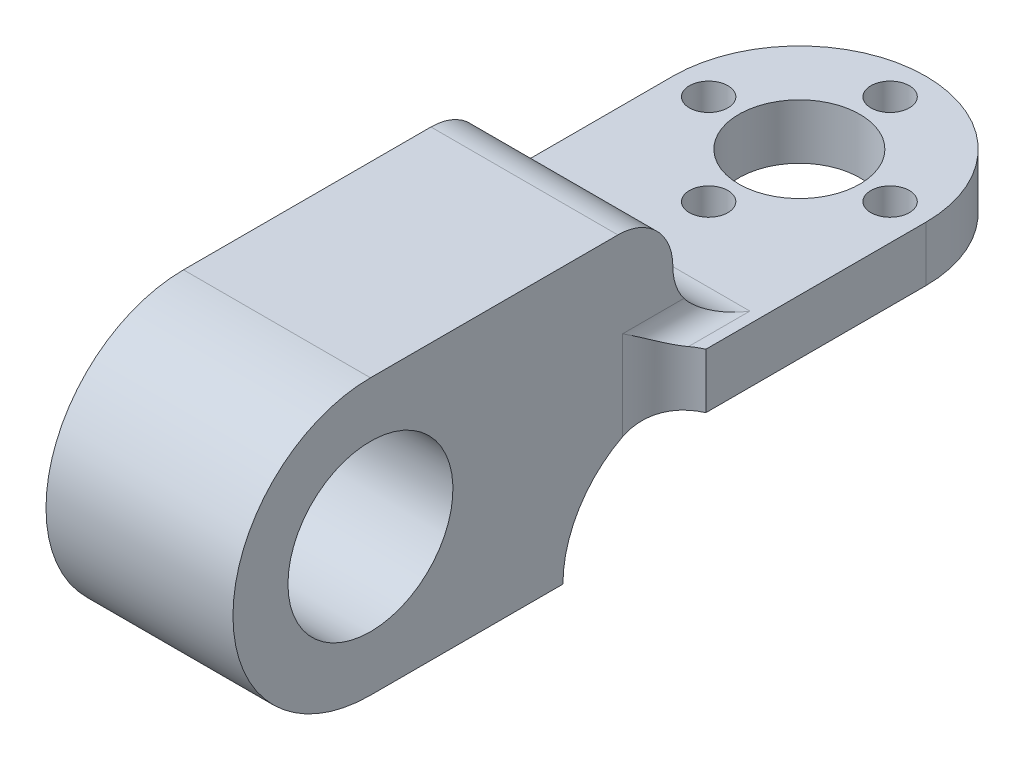
ISO-10303-21;
HEADER;
FILE_DESCRIPTION(('STEP AP214'),'2;1');
FILE_NAME('part.step','',(''),(''),'','','');
FILE_SCHEMA(('AUTOMOTIVE_DESIGN { 1 0 10303 214 1 1 1 1 }'));
ENDSEC;
DATA;
#1=APPLICATION_CONTEXT('core data for automotive mechanical design processes');
#2=APPLICATION_PROTOCOL_DEFINITION('international standard','automotive_design',2000,#1);
#3=PRODUCT_CONTEXT('',#1,'mechanical');
#4=PRODUCT('Part','Part','',(#3));
#5=PRODUCT_RELATED_PRODUCT_CATEGORY('part','',(#4));
#6=PRODUCT_DEFINITION_FORMATION('','',#4);
#7=PRODUCT_DEFINITION_CONTEXT('part definition',#1,'design');
#8=PRODUCT_DEFINITION('design','',#6,#7);
#9=PRODUCT_DEFINITION_SHAPE('','',#8);
#10=(LENGTH_UNIT() NAMED_UNIT(*) SI_UNIT(.MILLI.,.METRE.));
#11=(NAMED_UNIT(*) PLANE_ANGLE_UNIT() SI_UNIT($,.RADIAN.));
#12=(NAMED_UNIT(*) SI_UNIT($,.STERADIAN.) SOLID_ANGLE_UNIT());
#13=UNCERTAINTY_MEASURE_WITH_UNIT(LENGTH_MEASURE(1.E-05),#10,'distance_accuracy_value','');
#14=(GEOMETRIC_REPRESENTATION_CONTEXT(3) GLOBAL_UNCERTAINTY_ASSIGNED_CONTEXT((#13)) GLOBAL_UNIT_ASSIGNED_CONTEXT((#10,
#11,#12)) REPRESENTATION_CONTEXT('',''));
#15=CARTESIAN_POINT('',(0.,0.,0.));
#16=DIRECTION('',(0.,0.,1.));
#17=DIRECTION('',(1.,0.,0.));
#18=AXIS2_PLACEMENT_3D('',#15,#16,#17);
#19=CARTESIAN_POINT('',(0.,5.,0.));
#20=DIRECTION('',(0.,1.,0.));
#21=DIRECTION('',(0.,0.,1.));
#22=AXIS2_PLACEMENT_3D('',#19,#20,#21);
#23=PLANE('',#22);
#24=CARTESIAN_POINT('',(8.25,5.,0.));
#25=DIRECTION('',(0.,1.,0.));
#26=DIRECTION('',(0.,0.,1.));
#27=AXIS2_PLACEMENT_3D('',#24,#25,#26);
#28=CIRCLE('',#27,1.75);
#29=CARTESIAN_POINT('',(8.25,5.,1.75000000000006));
#30=VERTEX_POINT('',#29);
#31=EDGE_CURVE('E216',#30,#30,#28,.T.);
#32=ORIENTED_EDGE('',*,*,#31,.F.);
#33=EDGE_LOOP('',(#32));
#34=FACE_BOUND('',#33,.T.);
#35=CARTESIAN_POINT('',(-8.25,5.,0.));
#36=DIRECTION('',(0.,1.,0.));
#37=DIRECTION('',(0.,0.,1.));
#38=AXIS2_PLACEMENT_3D('',#35,#36,#37);
#39=CIRCLE('',#38,1.75);
#40=CARTESIAN_POINT('',(-8.25,5.,1.75));
#41=VERTEX_POINT('',#40);
#42=EDGE_CURVE('E228',#41,#41,#39,.T.);
#43=ORIENTED_EDGE('',*,*,#42,.F.);
#44=EDGE_LOOP('',(#43));
#45=FACE_BOUND('',#44,.T.);
#46=DIRECTION('',(1.,0.,0.));
#47=VECTOR('',#46,1.);
#48=CARTESIAN_POINT('',(0.,5.,15.));
#49=LINE('',#48,#47);
#50=CARTESIAN_POINT('',(-10.5,5.,15.));
#51=VERTEX_POINT('',#50);
#52=CARTESIAN_POINT('',(10.5,5.,15.));
#53=VERTEX_POINT('',#52);
#54=EDGE_CURVE('E243',#51,#53,#49,.T.);
#55=ORIENTED_EDGE('',*,*,#54,.T.);
#56=DIRECTION('',(0.,0.,1.));
#57=VECTOR('',#56,1.);
#58=CARTESIAN_POINT('',(10.5,5.,0.));
#59=LINE('',#58,#57);
#60=CARTESIAN_POINT('',(10.5,5.,20.5825756949558));
#61=VERTEX_POINT('',#60);
#62=EDGE_CURVE('E342',#53,#61,#59,.T.);
#63=ORIENTED_EDGE('',*,*,#62,.T.);
#64=CARTESIAN_POINT('',(13.5,5.,24.5825756949558));
#65=DIRECTION('',(0.,1.,0.));
#66=DIRECTION('',(0.,0.,1.));
#67=AXIS2_PLACEMENT_3D('',#64,#65,#66);
#68=CIRCLE('',#67,5.);
#69=CARTESIAN_POINT('',(11.5,5.,20.));
#70=VERTEX_POINT('',#69);
#71=EDGE_CURVE('E261',#61,#70,#68,.F.);
#72=ORIENTED_EDGE('',*,*,#71,.T.);
#73=DIRECTION('',(0.,0.,1.));
#74=VECTOR('',#73,1.);
#75=CARTESIAN_POINT('',(11.5,5.,-11.501));
#76=LINE('',#75,#74);
#77=CARTESIAN_POINT('',(11.5,5.,0.));
#78=VERTEX_POINT('',#77);
#79=EDGE_CURVE('E200',#78,#70,#76,.T.);
#80=ORIENTED_EDGE('',*,*,#79,.F.);
#81=CARTESIAN_POINT('',(0.,5.,0.));
#82=DIRECTION('',(0.,1.,0.));
#83=DIRECTION('',(0.,0.,1.));
#84=AXIS2_PLACEMENT_3D('',#81,#82,#83);
#85=CIRCLE('',#84,11.5);
#86=CARTESIAN_POINT('',(-11.5,5.,0.));
#87=VERTEX_POINT('',#86);
#88=EDGE_CURVE('E240',#78,#87,#85,.T.);
#89=ORIENTED_EDGE('',*,*,#88,.T.);
#90=DIRECTION('',(0.,0.,1.));
#91=VECTOR('',#90,1.);
#92=CARTESIAN_POINT('',(-11.5,5.,-11.501));
#93=LINE('',#92,#91);
#94=CARTESIAN_POINT('',(-11.5,5.,20.));
#95=VERTEX_POINT('',#94);
#96=EDGE_CURVE('E203',#87,#95,#93,.T.);
#97=ORIENTED_EDGE('',*,*,#96,.T.);
#98=CARTESIAN_POINT('',(-13.5,5.,24.5825756949558));
#99=DIRECTION('',(0.,1.,0.));
#100=DIRECTION('',(0.,0.,1.));
#101=AXIS2_PLACEMENT_3D('',#98,#99,#100);
#102=CIRCLE('',#101,5.);
#103=CARTESIAN_POINT('',(-10.5,5.,20.5825756949558));
#104=VERTEX_POINT('',#103);
#105=EDGE_CURVE('E349',#95,#104,#102,.F.);
#106=ORIENTED_EDGE('',*,*,#105,.T.);
#107=DIRECTION('',(0.,0.,-1.));
#108=VECTOR('',#107,1.);
#109=CARTESIAN_POINT('',(-10.5,5.,0.));
#110=LINE('',#109,#108);
#111=EDGE_CURVE('E346',#104,#51,#110,.T.);
#112=ORIENTED_EDGE('',*,*,#111,.T.);
#113=EDGE_LOOP('',(#55,#63,#72,#80,#89,#97,#106,#112));
#114=FACE_BOUND('',#113,.T.);
#115=CARTESIAN_POINT('',(0.,5.,0.));
#116=DIRECTION('',(0.,1.,0.));
#117=DIRECTION('',(0.,0.,1.));
#118=AXIS2_PLACEMENT_3D('',#115,#116,#117);
#119=CIRCLE('',#118,5.5);
#120=CARTESIAN_POINT('',(0.,5.,5.5));
#121=VERTEX_POINT('',#120);
#122=EDGE_CURVE('E234',#121,#121,#119,.T.);
#123=ORIENTED_EDGE('',*,*,#122,.F.);
#124=EDGE_LOOP('',(#123));
#125=FACE_BOUND('',#124,.T.);
#126=CARTESIAN_POINT('',(0.,5.,-8.25));
#127=DIRECTION('',(0.,1.,0.));
#128=DIRECTION('',(0.,0.,1.));
#129=AXIS2_PLACEMENT_3D('',#126,#127,#128);
#130=CIRCLE('',#129,1.75);
#131=CARTESIAN_POINT('',(0.,5.,-6.5));
#132=VERTEX_POINT('',#131);
#133=EDGE_CURVE('E222',#132,#132,#130,.T.);
#134=ORIENTED_EDGE('',*,*,#133,.F.);
#135=EDGE_LOOP('',(#134));
#136=FACE_BOUND('',#135,.T.);
#137=CARTESIAN_POINT('',(0.,5.,8.25));
#138=DIRECTION('',(0.,1.,0.));
#139=DIRECTION('',(0.,0.,1.));
#140=AXIS2_PLACEMENT_3D('',#137,#138,#139);
#141=CIRCLE('',#140,1.75);
#142=CARTESIAN_POINT('',(0.,5.,10.));
#143=VERTEX_POINT('',#142);
#144=EDGE_CURVE('E210',#143,#143,#141,.T.);
#145=ORIENTED_EDGE('',*,*,#144,.F.);
#146=EDGE_LOOP('',(#145));
#147=FACE_BOUND('',#146,.T.);
#148=ADVANCED_FACE('F37',(#34,#45,#114,#125,#136,#147),#23,.T.);
#149=CARTESIAN_POINT('',(0.,0.,0.));
#150=DIRECTION('',(0.,1.,0.));
#151=DIRECTION('',(0.,0.,1.));
#152=AXIS2_PLACEMENT_3D('',#149,#150,#151);
#153=PLANE('',#152);
#154=CARTESIAN_POINT('',(0.,0.,0.));
#155=DIRECTION('',(0.,1.,0.));
#156=DIRECTION('',(0.,0.,1.));
#157=AXIS2_PLACEMENT_3D('',#154,#155,#156);
#158=CIRCLE('',#157,11.5);
#159=CARTESIAN_POINT('',(11.5,0.,0.));
#160=VERTEX_POINT('',#159);
#161=CARTESIAN_POINT('',(-11.5,0.,0.));
#162=VERTEX_POINT('',#161);
#163=EDGE_CURVE('E237',#160,#162,#158,.T.);
#164=ORIENTED_EDGE('',*,*,#163,.F.);
#165=DIRECTION('',(0.,0.,1.));
#166=VECTOR('',#165,1.);
#167=CARTESIAN_POINT('',(11.5,0.,-11.501));
#168=LINE('',#167,#166);
#169=CARTESIAN_POINT('',(11.5,0.,20.));
#170=VERTEX_POINT('',#169);
#171=EDGE_CURVE('E197',#160,#170,#168,.T.);
#172=ORIENTED_EDGE('',*,*,#171,.T.);
#173=DIRECTION('',(-1.,0.,0.));
#174=VECTOR('',#173,1.);
#175=CARTESIAN_POINT('',(11.5,0.,20.));
#176=LINE('',#175,#174);
#177=CARTESIAN_POINT('',(-11.5,0.,20.));
#178=VERTEX_POINT('',#177);
#179=EDGE_CURVE('E185',#170,#178,#176,.T.);
#180=ORIENTED_EDGE('',*,*,#179,.T.);
#181=DIRECTION('',(0.,0.,1.));
#182=VECTOR('',#181,1.);
#183=CARTESIAN_POINT('',(-11.5,0.,-11.501));
#184=LINE('',#183,#182);
#185=EDGE_CURVE('E205',#162,#178,#184,.T.);
#186=ORIENTED_EDGE('',*,*,#185,.F.);
#187=EDGE_LOOP('',(#164,#172,#180,#186));
#188=FACE_BOUND('',#187,.T.);
#189=CARTESIAN_POINT('',(0.,0.,0.));
#190=DIRECTION('',(0.,1.,0.));
#191=DIRECTION('',(0.,0.,1.));
#192=AXIS2_PLACEMENT_3D('',#189,#190,#191);
#193=CIRCLE('',#192,5.5);
#194=CARTESIAN_POINT('',(0.,0.,5.5));
#195=VERTEX_POINT('',#194);
#196=EDGE_CURVE('E231',#195,#195,#193,.T.);
#197=ORIENTED_EDGE('',*,*,#196,.T.);
#198=EDGE_LOOP('',(#197));
#199=FACE_BOUND('',#198,.T.);
#200=CARTESIAN_POINT('',(-8.25,0.,0.));
#201=DIRECTION('',(0.,1.,0.));
#202=DIRECTION('',(0.,0.,1.));
#203=AXIS2_PLACEMENT_3D('',#200,#201,#202);
#204=CIRCLE('',#203,1.75);
#205=CARTESIAN_POINT('',(-8.25,0.,1.75));
#206=VERTEX_POINT('',#205);
#207=EDGE_CURVE('E225',#206,#206,#204,.T.);
#208=ORIENTED_EDGE('',*,*,#207,.T.);
#209=EDGE_LOOP('',(#208));
#210=FACE_BOUND('',#209,.T.);
#211=CARTESIAN_POINT('',(0.,0.,-8.25));
#212=DIRECTION('',(0.,1.,0.));
#213=DIRECTION('',(0.,0.,1.));
#214=AXIS2_PLACEMENT_3D('',#211,#212,#213);
#215=CIRCLE('',#214,1.75);
#216=CARTESIAN_POINT('',(0.,0.,-6.5));
#217=VERTEX_POINT('',#216);
#218=EDGE_CURVE('E219',#217,#217,#215,.T.);
#219=ORIENTED_EDGE('',*,*,#218,.T.);
#220=EDGE_LOOP('',(#219));
#221=FACE_BOUND('',#220,.T.);
#222=CARTESIAN_POINT('',(8.25,0.,0.));
#223=DIRECTION('',(0.,1.,0.));
#224=DIRECTION('',(0.,0.,1.));
#225=AXIS2_PLACEMENT_3D('',#222,#223,#224);
#226=CIRCLE('',#225,1.75);
#227=CARTESIAN_POINT('',(8.25,0.,1.75000000000006));
#228=VERTEX_POINT('',#227);
#229=EDGE_CURVE('E213',#228,#228,#226,.T.);
#230=ORIENTED_EDGE('',*,*,#229,.T.);
#231=EDGE_LOOP('',(#230));
#232=FACE_BOUND('',#231,.T.);
#233=CARTESIAN_POINT('',(0.,0.,8.25));
#234=DIRECTION('',(0.,1.,0.));
#235=DIRECTION('',(0.,0.,1.));
#236=AXIS2_PLACEMENT_3D('',#233,#234,#235);
#237=CIRCLE('',#236,1.75);
#238=CARTESIAN_POINT('',(0.,0.,10.));
#239=VERTEX_POINT('',#238);
#240=EDGE_CURVE('E188',#239,#239,#237,.T.);
#241=ORIENTED_EDGE('',*,*,#240,.T.);
#242=EDGE_LOOP('',(#241));
#243=FACE_BOUND('',#242,.T.);
#244=ADVANCED_FACE('F313',(#188,#199,#210,#221,#232,#243),#153,.F.);
#245=CARTESIAN_POINT('',(0.,5.,0.));
#246=DIRECTION('',(0.,-1.,0.));
#247=DIRECTION('',(0.,0.,-1.));
#248=AXIS2_PLACEMENT_3D('',#245,#246,#247);
#249=CYLINDRICAL_SURFACE('',#248,11.5);
#250=ORIENTED_EDGE('',*,*,#88,.F.);
#251=DIRECTION('',(0.,-1.,0.));
#252=VECTOR('',#251,1.);
#253=CARTESIAN_POINT('',(11.5,5.,0.));
#254=LINE('',#253,#252);
#255=EDGE_CURVE('E189',#160,#78,#254,.F.);
#256=ORIENTED_EDGE('',*,*,#255,.F.);
#257=ORIENTED_EDGE('',*,*,#163,.T.);
#258=DIRECTION('',(0.,-1.,0.));
#259=VECTOR('',#258,1.);
#260=CARTESIAN_POINT('',(-11.5,5.,0.));
#261=LINE('',#260,#259);
#262=EDGE_CURVE('E186',#162,#87,#261,.F.);
#263=ORIENTED_EDGE('',*,*,#262,.T.);
#264=EDGE_LOOP('',(#250,#256,#257,#263));
#265=FACE_BOUND('',#264,.T.);
#266=ADVANCED_FACE('F319',(#265),#249,.T.);
#267=CARTESIAN_POINT('',(0.,5.,0.));
#268=DIRECTION('',(0.,-1.,0.));
#269=DIRECTION('',(0.,0.,-1.));
#270=AXIS2_PLACEMENT_3D('',#267,#268,#269);
#271=CYLINDRICAL_SURFACE('',#270,5.5);
#272=ORIENTED_EDGE('',*,*,#122,.T.);
#273=EDGE_LOOP('',(#272));
#274=FACE_BOUND('',#273,.T.);
#275=ORIENTED_EDGE('',*,*,#196,.F.);
#276=EDGE_LOOP('',(#275));
#277=FACE_BOUND('',#276,.T.);
#278=ADVANCED_FACE('F325',(#274,#277),#271,.F.);
#279=CARTESIAN_POINT('',(-8.25,5.,0.));
#280=DIRECTION('',(0.,-1.,0.));
#281=DIRECTION('',(0.,0.,-1.));
#282=AXIS2_PLACEMENT_3D('',#279,#280,#281);
#283=CYLINDRICAL_SURFACE('',#282,1.75);
#284=ORIENTED_EDGE('',*,*,#42,.T.);
#285=EDGE_LOOP('',(#284));
#286=FACE_BOUND('',#285,.T.);
#287=ORIENTED_EDGE('',*,*,#207,.F.);
#288=EDGE_LOOP('',(#287));
#289=FACE_BOUND('',#288,.T.);
#290=ADVANCED_FACE('F418',(#286,#289),#283,.F.);
#291=CARTESIAN_POINT('',(0.,5.,-8.25));
#292=DIRECTION('',(0.,-1.,0.));
#293=DIRECTION('',(0.,0.,-1.));
#294=AXIS2_PLACEMENT_3D('',#291,#292,#293);
#295=CYLINDRICAL_SURFACE('',#294,1.75);
#296=ORIENTED_EDGE('',*,*,#133,.T.);
#297=EDGE_LOOP('',(#296));
#298=FACE_BOUND('',#297,.T.);
#299=ORIENTED_EDGE('',*,*,#218,.F.);
#300=EDGE_LOOP('',(#299));
#301=FACE_BOUND('',#300,.T.);
#302=ADVANCED_FACE('F415',(#298,#301),#295,.F.);
#303=CARTESIAN_POINT('',(8.25,5.,0.));
#304=DIRECTION('',(0.,-1.,0.));
#305=DIRECTION('',(0.,0.,-1.));
#306=AXIS2_PLACEMENT_3D('',#303,#304,#305);
#307=CYLINDRICAL_SURFACE('',#306,1.75);
#308=ORIENTED_EDGE('',*,*,#31,.T.);
#309=EDGE_LOOP('',(#308));
#310=FACE_BOUND('',#309,.T.);
#311=ORIENTED_EDGE('',*,*,#229,.F.);
#312=EDGE_LOOP('',(#311));
#313=FACE_BOUND('',#312,.T.);
#314=ADVANCED_FACE('F411',(#310,#313),#307,.F.);
#315=CARTESIAN_POINT('',(0.,5.,8.25));
#316=DIRECTION('',(0.,-1.,0.));
#317=DIRECTION('',(0.,0.,-1.));
#318=AXIS2_PLACEMENT_3D('',#315,#316,#317);
#319=CYLINDRICAL_SURFACE('',#318,1.75);
#320=ORIENTED_EDGE('',*,*,#144,.T.);
#321=EDGE_LOOP('',(#320));
#322=FACE_BOUND('',#321,.T.);
#323=ORIENTED_EDGE('',*,*,#240,.F.);
#324=EDGE_LOOP('',(#323));
#325=FACE_BOUND('',#324,.T.);
#326=ADVANCED_FACE('F406',(#322,#325),#319,.F.);
#327=CARTESIAN_POINT('',(11.5,5.,-11.501));
#328=DIRECTION('',(-1.,0.,0.));
#329=DIRECTION('',(0.,0.,1.));
#330=AXIS2_PLACEMENT_3D('',#327,#328,#329);
#331=PLANE('',#330);
#332=ORIENTED_EDGE('',*,*,#171,.F.);
#333=ORIENTED_EDGE('',*,*,#255,.T.);
#334=ORIENTED_EDGE('',*,*,#79,.T.);
#335=DIRECTION('',(0.,-1.,0.));
#336=VECTOR('',#335,1.);
#337=CARTESIAN_POINT('',(11.5,5.,20.));
#338=LINE('',#337,#336);
#339=EDGE_CURVE('E194',#70,#170,#338,.T.);
#340=ORIENTED_EDGE('',*,*,#339,.T.);
#341=EDGE_LOOP('',(#332,#333,#334,#340));
#342=FACE_BOUND('',#341,.T.);
#343=ADVANCED_FACE('F366',(#342),#331,.F.);
#344=CARTESIAN_POINT('',(-11.5,0.,-11.501));
#345=DIRECTION('',(1.,0.,0.));
#346=DIRECTION('',(0.,0.,-1.));
#347=AXIS2_PLACEMENT_3D('',#344,#345,#346);
#348=PLANE('',#347);
#349=ORIENTED_EDGE('',*,*,#262,.F.);
#350=ORIENTED_EDGE('',*,*,#185,.T.);
#351=DIRECTION('',(0.,1.,0.));
#352=VECTOR('',#351,1.);
#353=CARTESIAN_POINT('',(-11.5,0.,20.));
#354=LINE('',#353,#352);
#355=EDGE_CURVE('E191',#178,#95,#354,.T.);
#356=ORIENTED_EDGE('',*,*,#355,.T.);
#357=ORIENTED_EDGE('',*,*,#96,.F.);
#358=EDGE_LOOP('',(#349,#350,#356,#357));
#359=FACE_BOUND('',#358,.T.);
#360=ADVANCED_FACE('F358',(#359),#348,.F.);
#361=CARTESIAN_POINT('',(-8.5,2.5,47.5));
#362=DIRECTION('',(-1.,0.,0.));
#363=DIRECTION('',(0.,0.,1.));
#364=AXIS2_PLACEMENT_3D('',#361,#362,#363);
#365=CYLINDRICAL_SURFACE('',#364,12.5);
#366=DIRECTION('',(1.,0.,0.));
#367=VECTOR('',#366,1.);
#368=CARTESIAN_POINT('',(-8.5,15.,47.5));
#369=LINE('',#368,#367);
#370=CARTESIAN_POINT('',(-8.5,15.,47.5));
#371=VERTEX_POINT('',#370);
#372=CARTESIAN_POINT('',(8.5,15.,47.5));
#373=VERTEX_POINT('',#372);
#374=EDGE_CURVE('E177',#371,#373,#369,.T.);
#375=ORIENTED_EDGE('',*,*,#374,.F.);
#376=CARTESIAN_POINT('',(-8.5,2.5,47.5));
#377=DIRECTION('',(1.,0.,0.));
#378=DIRECTION('',(0.,1.,0.));
#379=AXIS2_PLACEMENT_3D('',#376,#377,#378);
#380=CIRCLE('',#379,12.5);
#381=CARTESIAN_POINT('',(-8.5,-10.,47.5));
#382=VERTEX_POINT('',#381);
#383=EDGE_CURVE('E181',#382,#371,#380,.F.);
#384=ORIENTED_EDGE('',*,*,#383,.F.);
#385=DIRECTION('',(1.,0.,0.));
#386=VECTOR('',#385,1.);
#387=CARTESIAN_POINT('',(-8.5,-10.,47.5));
#388=LINE('',#387,#386);
#389=CARTESIAN_POINT('',(8.5,-10.,47.5));
#390=VERTEX_POINT('',#389);
#391=EDGE_CURVE('E164',#390,#382,#388,.F.);
#392=ORIENTED_EDGE('',*,*,#391,.F.);
#393=CARTESIAN_POINT('',(8.5,2.5,47.5));
#394=DIRECTION('',(-1.,0.,0.));
#395=DIRECTION('',(0.,-1.,0.));
#396=AXIS2_PLACEMENT_3D('',#393,#394,#395);
#397=CIRCLE('',#396,12.5);
#398=EDGE_CURVE('E183',#373,#390,#397,.F.);
#399=ORIENTED_EDGE('',*,*,#398,.F.);
#400=EDGE_LOOP('',(#375,#384,#392,#399));
#401=FACE_BOUND('',#400,.T.);
#402=ADVANCED_FACE('F397',(#401),#365,.T.);
#403=CARTESIAN_POINT('',(8.5,15.,60.));
#404=DIRECTION('',(-1.,0.,0.));
#405=DIRECTION('',(0.,-1.,0.));
#406=AXIS2_PLACEMENT_3D('',#403,#404,#405);
#407=PLANE('',#406);
#408=CARTESIAN_POINT('',(8.5,2.5,47.5));
#409=DIRECTION('',(-1.,0.,0.));
#410=DIRECTION('',(0.,-1.,0.));
#411=AXIS2_PLACEMENT_3D('',#408,#409,#410);
#412=CIRCLE('',#411,7.5);
#413=CARTESIAN_POINT('',(8.5,-5.,47.5));
#414=VERTEX_POINT('',#413);
#415=EDGE_CURVE('E171',#414,#414,#412,.T.);
#416=ORIENTED_EDGE('',*,*,#415,.T.);
#417=EDGE_LOOP('',(#416));
#418=FACE_BOUND('',#417,.T.);
#419=DIRECTION('',(0.,1.,0.));
#420=VECTOR('',#419,1.);
#421=CARTESIAN_POINT('',(8.5,15.,24.5825756949558));
#422=LINE('',#421,#420);
#423=CARTESIAN_POINT('',(8.50000000000001,-1.11180558268441,24.5825756949558));
#424=VERTEX_POINT('',#423);
#425=CARTESIAN_POINT('',(8.5,7.,24.5825756949558));
#426=VERTEX_POINT('',#425);
#427=EDGE_CURVE('E158',#424,#426,#422,.T.);
#428=ORIENTED_EDGE('',*,*,#427,.T.);
#429=DIRECTION('',(0.,0.,1.));
#430=VECTOR('',#429,1.);
#431=CARTESIAN_POINT('',(8.5,7.,60.));
#432=LINE('',#431,#430);
#433=CARTESIAN_POINT('',(8.5,7.,19.));
#434=VERTEX_POINT('',#433);
#435=EDGE_CURVE('E345',#426,#434,#432,.F.);
#436=ORIENTED_EDGE('',*,*,#435,.T.);
#437=CARTESIAN_POINT('',(8.5,10.,15.));
#438=DIRECTION('',(-1.,0.,0.));
#439=DIRECTION('',(0.,-1.,0.));
#440=AXIS2_PLACEMENT_3D('',#437,#438,#439);
#441=CIRCLE('',#440,5.);
#442=CARTESIAN_POINT('',(8.5,10.,20.));
#443=VERTEX_POINT('',#442);
#444=EDGE_CURVE('E252',#434,#443,#441,.T.);
#445=ORIENTED_EDGE('',*,*,#444,.T.);
#446=CARTESIAN_POINT('',(8.5,10.,25.));
#447=DIRECTION('',(-1.,0.,0.));
#448=DIRECTION('',(0.,-1.,0.));
#449=AXIS2_PLACEMENT_3D('',#446,#447,#448);
#450=CIRCLE('',#449,5.);
#451=CARTESIAN_POINT('',(8.5,15.,25.));
#452=VERTEX_POINT('',#451);
#453=EDGE_CURVE('E250',#443,#452,#450,.F.);
#454=ORIENTED_EDGE('',*,*,#453,.T.);
#455=DIRECTION('',(0.,0.,-1.));
#456=VECTOR('',#455,1.);
#457=CARTESIAN_POINT('',(8.5,15.,60.));
#458=LINE('',#457,#456);
#459=EDGE_CURVE('E169',#373,#452,#458,.T.);
#460=ORIENTED_EDGE('',*,*,#459,.F.);
#461=ORIENTED_EDGE('',*,*,#398,.T.);
#462=DIRECTION('',(0.,0.,-1.));
#463=VECTOR('',#462,1.);
#464=CARTESIAN_POINT('',(8.5,-10.,60.));
#465=LINE('',#464,#463);
#466=CARTESIAN_POINT('',(8.5,-10.,30.));
#467=VERTEX_POINT('',#466);
#468=EDGE_CURVE('E166',#390,#467,#465,.T.);
#469=ORIENTED_EDGE('',*,*,#468,.T.);
#470=CARTESIAN_POINT('',(8.50000000000001,-10.,20.));
#471=DIRECTION('',(-1.,0.,0.));
#472=DIRECTION('',(0.,-1.,0.));
#473=AXIS2_PLACEMENT_3D('',#470,#471,#472);
#474=CIRCLE('',#473,10.);
#475=EDGE_CURVE('E149',#467,#424,#474,.T.);
#476=ORIENTED_EDGE('',*,*,#475,.T.);
#477=EDGE_LOOP('',(#428,#436,#445,#454,#460,#461,#469,#476));
#478=FACE_BOUND('',#477,.T.);
#479=ADVANCED_FACE('F370',(#418,#478),#407,.F.);
#480=CARTESIAN_POINT('',(-8.5,15.,60.));
#481=DIRECTION('',(0.,-1.,0.));
#482=DIRECTION('',(0.,0.,-1.));
#483=AXIS2_PLACEMENT_3D('',#480,#481,#482);
#484=PLANE('',#483);
#485=ORIENTED_EDGE('',*,*,#459,.T.);
#486=DIRECTION('',(-1.,0.,0.));
#487=VECTOR('',#486,1.);
#488=CARTESIAN_POINT('',(-8.5,15.,25.));
#489=LINE('',#488,#487);
#490=CARTESIAN_POINT('',(-8.5,15.,25.));
#491=VERTEX_POINT('',#490);
#492=EDGE_CURVE('E246',#452,#491,#489,.T.);
#493=ORIENTED_EDGE('',*,*,#492,.T.);
#494=DIRECTION('',(0.,0.,-1.));
#495=VECTOR('',#494,1.);
#496=CARTESIAN_POINT('',(-8.5,15.,60.));
#497=LINE('',#496,#495);
#498=EDGE_CURVE('E165',#371,#491,#497,.T.);
#499=ORIENTED_EDGE('',*,*,#498,.F.);
#500=ORIENTED_EDGE('',*,*,#374,.T.);
#501=EDGE_LOOP('',(#485,#493,#499,#500));
#502=FACE_BOUND('',#501,.T.);
#503=ADVANCED_FACE('F390',(#502),#484,.F.);
#504=CARTESIAN_POINT('',(-8.5,15.,60.));
#505=DIRECTION('',(1.,0.,0.));
#506=DIRECTION('',(0.,1.,0.));
#507=AXIS2_PLACEMENT_3D('',#504,#505,#506);
#508=PLANE('',#507);
#509=CARTESIAN_POINT('',(-8.5,2.5,47.5));
#510=DIRECTION('',(-1.,0.,0.));
#511=DIRECTION('',(0.,0.,1.));
#512=AXIS2_PLACEMENT_3D('',#509,#510,#511);
#513=CIRCLE('',#512,7.5);
#514=CARTESIAN_POINT('',(-8.5,2.5,55.));
#515=VERTEX_POINT('',#514);
#516=EDGE_CURVE('E257',#515,#515,#513,.T.);
#517=ORIENTED_EDGE('',*,*,#516,.F.);
#518=EDGE_LOOP('',(#517));
#519=FACE_BOUND('',#518,.T.);
#520=CARTESIAN_POINT('',(-8.5,10.,15.));
#521=DIRECTION('',(1.,0.,0.));
#522=DIRECTION('',(0.,1.,0.));
#523=AXIS2_PLACEMENT_3D('',#520,#521,#522);
#524=CIRCLE('',#523,5.);
#525=CARTESIAN_POINT('',(-8.5,10.,20.));
#526=VERTEX_POINT('',#525);
#527=CARTESIAN_POINT('',(-8.5,7.,19.));
#528=VERTEX_POINT('',#527);
#529=EDGE_CURVE('E159',#526,#528,#524,.T.);
#530=ORIENTED_EDGE('',*,*,#529,.T.);
#531=DIRECTION('',(0.,0.,-1.));
#532=VECTOR('',#531,1.);
#533=CARTESIAN_POINT('',(-8.5,7.,60.));
#534=LINE('',#533,#532);
#535=CARTESIAN_POINT('',(-8.5,7.,24.5825756949558));
#536=VERTEX_POINT('',#535);
#537=EDGE_CURVE('E296',#528,#536,#534,.F.);
#538=ORIENTED_EDGE('',*,*,#537,.T.);
#539=DIRECTION('',(0.,-1.,0.));
#540=VECTOR('',#539,1.);
#541=CARTESIAN_POINT('',(-8.5,15.,24.5825756949558));
#542=LINE('',#541,#540);
#543=CARTESIAN_POINT('',(-8.50000000000001,-1.11180558268441,24.5825756949558));
#544=VERTEX_POINT('',#543);
#545=EDGE_CURVE('E56',#536,#544,#542,.T.);
#546=ORIENTED_EDGE('',*,*,#545,.T.);
#547=CARTESIAN_POINT('',(-8.50000000000001,-10.,20.));
#548=DIRECTION('',(1.,0.,0.));
#549=DIRECTION('',(0.,1.,0.));
#550=AXIS2_PLACEMENT_3D('',#547,#548,#549);
#551=CIRCLE('',#550,10.);
#552=CARTESIAN_POINT('',(-8.49999999999999,-10.,30.));
#553=VERTEX_POINT('',#552);
#554=EDGE_CURVE('E142',#544,#553,#551,.T.);
#555=ORIENTED_EDGE('',*,*,#554,.T.);
#556=DIRECTION('',(0.,0.,-1.));
#557=VECTOR('',#556,1.);
#558=CARTESIAN_POINT('',(-8.5,-10.,60.));
#559=LINE('',#558,#557);
#560=EDGE_CURVE('E146',#382,#553,#559,.T.);
#561=ORIENTED_EDGE('',*,*,#560,.F.);
#562=ORIENTED_EDGE('',*,*,#383,.T.);
#563=ORIENTED_EDGE('',*,*,#498,.T.);
#564=CARTESIAN_POINT('',(-8.5,10.,25.));
#565=DIRECTION('',(1.,0.,0.));
#566=DIRECTION('',(0.,1.,0.));
#567=AXIS2_PLACEMENT_3D('',#564,#565,#566);
#568=CIRCLE('',#567,5.);
#569=EDGE_CURVE('E248',#491,#526,#568,.F.);
#570=ORIENTED_EDGE('',*,*,#569,.T.);
#571=EDGE_LOOP('',(#530,#538,#546,#555,#561,#562,#563,#570));
#572=FACE_BOUND('',#571,.T.);
#573=ADVANCED_FACE('F144',(#519,#572),#508,.F.);
#574=CARTESIAN_POINT('',(-8.5,-10.,60.));
#575=DIRECTION('',(0.,1.,0.));
#576=DIRECTION('',(0.,0.,1.));
#577=AXIS2_PLACEMENT_3D('',#574,#575,#576);
#578=PLANE('',#577);
#579=ORIENTED_EDGE('',*,*,#560,.T.);
#580=DIRECTION('',(1.,0.,0.));
#581=VECTOR('',#580,1.);
#582=CARTESIAN_POINT('',(-128.699561014691,-10.,30.));
#583=LINE('',#582,#581);
#584=EDGE_CURVE('E152',#553,#467,#583,.T.);
#585=ORIENTED_EDGE('',*,*,#584,.T.);
#586=ORIENTED_EDGE('',*,*,#468,.F.);
#587=ORIENTED_EDGE('',*,*,#391,.T.);
#588=EDGE_LOOP('',(#579,#585,#586,#587));
#589=FACE_BOUND('',#588,.T.);
#590=ADVANCED_FACE('F162',(#589),#578,.F.);
#591=CARTESIAN_POINT('',(11.5,2.5,47.5));
#592=DIRECTION('',(-1.,0.,0.));
#593=DIRECTION('',(0.,0.,1.));
#594=AXIS2_PLACEMENT_3D('',#591,#592,#593);
#595=CYLINDRICAL_SURFACE('',#594,7.5);
#596=ORIENTED_EDGE('',*,*,#516,.T.);
#597=EDGE_LOOP('',(#596));
#598=FACE_BOUND('',#597,.T.);
#599=ORIENTED_EDGE('',*,*,#415,.F.);
#600=EDGE_LOOP('',(#599));
#601=FACE_BOUND('',#600,.T.);
#602=ADVANCED_FACE('F378',(#598,#601),#595,.F.);
#603=CARTESIAN_POINT('',(-8.5,10.,25.));
#604=DIRECTION('',(-1.,0.,0.));
#605=DIRECTION('',(0.,0.,1.));
#606=AXIS2_PLACEMENT_3D('',#603,#604,#605);
#607=CYLINDRICAL_SURFACE('',#606,5.);
#608=DIRECTION('',(-1.,0.,0.));
#609=VECTOR('',#608,1.);
#610=CARTESIAN_POINT('',(0.,10.,20.));
#611=LINE('',#610,#609);
#612=EDGE_CURVE('E255',#526,#443,#611,.F.);
#613=ORIENTED_EDGE('',*,*,#612,.F.);
#614=ORIENTED_EDGE('',*,*,#569,.F.);
#615=ORIENTED_EDGE('',*,*,#492,.F.);
#616=ORIENTED_EDGE('',*,*,#453,.F.);
#617=EDGE_LOOP('',(#613,#614,#615,#616));
#618=FACE_BOUND('',#617,.T.);
#619=ADVANCED_FACE('F283',(#618),#607,.T.);
#620=CARTESIAN_POINT('',(0.,10.,15.));
#621=DIRECTION('',(1.,0.,0.));
#622=DIRECTION('',(0.,0.,-1.));
#623=AXIS2_PLACEMENT_3D('',#620,#621,#622);
#624=CYLINDRICAL_SURFACE('',#623,5.);
#625=ORIENTED_EDGE('',*,*,#529,.F.);
#626=ORIENTED_EDGE('',*,*,#612,.T.);
#627=ORIENTED_EDGE('',*,*,#444,.F.);
#628=CARTESIAN_POINT('',(8.5,7.,19.));
#629=CARTESIAN_POINT('',(8.50000675972657,6.93158584431927,18.9487080610621));
#630=CARTESIAN_POINT('',(8.50350842796633,6.86455821852767,18.8956778094956));
#631=CARTESIAN_POINT('',(8.51671090290415,6.73376301953585,18.7866726896654));
#632=CARTESIAN_POINT('',(8.52640098440018,6.66999001182352,18.7307030693738));
#633=CARTESIAN_POINT('',(8.55107718728248,6.54654150724053,18.6167152356291));
#634=CARTESIAN_POINT('',(8.56601209046857,6.48683282305515,18.5587215528404));
#635=CARTESIAN_POINT('',(8.60052227484143,6.37100202672924,18.4405267617593));
#636=CARTESIAN_POINT('',(8.62010027868032,6.3148820435623,18.3803243758878));
#637=CARTESIAN_POINT('',(8.67244414905785,6.18332284605751,18.2321085619681));
#638=CARTESIAN_POINT('',(8.70728142470638,6.10978618138672,18.1431302063391));
#639=CARTESIAN_POINT('',(8.78360058480636,5.97029430762885,17.9621850965987));
#640=CARTESIAN_POINT('',(8.82508412025497,5.90434098933117,17.8702176044928));
#641=CARTESIAN_POINT('',(8.95811121958218,5.71697330125327,17.5896743194651));
#642=CARTESIAN_POINT('',(9.05789389268571,5.60683184948249,17.3973511891724));
#643=CARTESIAN_POINT('',(9.24026359924361,5.4432848498546,17.0639931913121));
#644=CARTESIAN_POINT('',(9.3193534892754,5.38270544554123,16.9243958449696));
#645=CARTESIAN_POINT('',(9.48279375794198,5.27522285035326,16.6429135419546));
#646=CARTESIAN_POINT('',(9.56714643352449,5.22832568251079,16.5010276067419));
#647=CARTESIAN_POINT('',(9.73931143366017,5.14787588521363,16.2160487263164));
#648=CARTESIAN_POINT('',(9.82711619507983,5.11429569469862,16.0729589065398));
#649=CARTESIAN_POINT('',(10.0050321913334,5.0599857310582,15.7858725815477));
#650=CARTESIAN_POINT('',(10.0951426785276,5.03925184610523,15.6418763813678));
#651=CARTESIAN_POINT('',(10.287554785683,5.00865251719647,15.3359258819783));
#652=CARTESIAN_POINT('',(10.3900148896152,5.00040130739057,15.1739022200003));
#653=CARTESIAN_POINT('',(10.494960502319,5.00000476459275,15.0079681464868));
#654=CARTESIAN_POINT('',(10.4974802675754,5.00000000295223,15.0039840478495));
#655=CARTESIAN_POINT('',(10.5,5.,15.));
#656=B_SPLINE_CURVE_WITH_KNOTS('',3,(#628,#629,#630,#631,#632,#633,#634,#635,#636,#637,#638,
#639,#640,#641,#642,#643,#644,#645,#646,#647,#648,#649,#650,#651,#652,#653,#654,#655),
.UNSPECIFIED.,.F.,.F.,(4,2,2,2,2,2,2,2,2,2,2,2,2,4),(0.,0.25632358612088,0.512204136350952,
0.765652360303693,1.01924957198093,1.38041574025909,1.74167176531566,2.46784096790538,
2.9817850181479,3.49595497056345,4.00905516339228,4.52199103886929,5.09684964624113,
5.11099178908029),.UNSPECIFIED.);
#657=EDGE_CURVE('E295',#434,#53,#656,.T.);
#658=ORIENTED_EDGE('',*,*,#657,.T.);
#659=ORIENTED_EDGE('',*,*,#54,.F.);
#660=CARTESIAN_POINT('',(-8.5,7.,19.));
#661=CARTESIAN_POINT('',(-8.50000675972657,6.93158584431927,18.9487080610621));
#662=CARTESIAN_POINT('',(-8.50350842796633,6.86455821852767,18.8956778094956));
#663=CARTESIAN_POINT('',(-8.51671090290415,6.73376301953585,18.7866726896654));
#664=CARTESIAN_POINT('',(-8.52640098440018,6.66999001182352,18.7307030693738));
#665=CARTESIAN_POINT('',(-8.55107718728249,6.54654150724053,18.6167152356291));
#666=CARTESIAN_POINT('',(-8.56601209046857,6.48683282305515,18.5587215528404));
#667=CARTESIAN_POINT('',(-8.60052227484144,6.37100202672924,18.4405267617593));
#668=CARTESIAN_POINT('',(-8.62010027868032,6.3148820435623,18.3803243758878));
#669=CARTESIAN_POINT('',(-8.67244414905785,6.18332284605751,18.2321085619681));
#670=CARTESIAN_POINT('',(-8.70728142470638,6.10978618138672,18.1431302063391));
#671=CARTESIAN_POINT('',(-8.78360058480636,5.97029430762885,17.9621850965987));
#672=CARTESIAN_POINT('',(-8.82508412025497,5.90434098933117,17.8702176044928));
#673=CARTESIAN_POINT('',(-8.95811121958218,5.71697330125327,17.5896743194651));
#674=CARTESIAN_POINT('',(-9.05789389268571,5.60683184948249,17.3973511891724));
#675=CARTESIAN_POINT('',(-9.24026359924361,5.4432848498546,17.0639931913121));
#676=CARTESIAN_POINT('',(-9.3193534892754,5.38270544554123,16.9243958449696));
#677=CARTESIAN_POINT('',(-9.48279375794198,5.27522285035326,16.6429135419546));
#678=CARTESIAN_POINT('',(-9.56714643352449,5.22832568251079,16.5010276067419));
#679=CARTESIAN_POINT('',(-9.73931143366017,5.14787588521363,16.2160487263164));
#680=CARTESIAN_POINT('',(-9.82711619507983,5.11429569469862,16.0729589065398));
#681=CARTESIAN_POINT('',(-10.0050321913334,5.0599857310582,15.7858725815477));
#682=CARTESIAN_POINT('',(-10.0951426785276,5.03925184610523,15.6418763813678));
#683=CARTESIAN_POINT('',(-10.287554785683,5.00865251719647,15.3359258819783));
#684=CARTESIAN_POINT('',(-10.3900148896152,5.00040130739057,15.1739022200003));
#685=CARTESIAN_POINT('',(-10.494960502319,5.00000476459275,15.0079681464868));
#686=CARTESIAN_POINT('',(-10.4974802675754,5.00000000295223,15.0039840478495));
#687=CARTESIAN_POINT('',(-10.5,5.,15.));
#688=B_SPLINE_CURVE_WITH_KNOTS('',3,(#660,#661,#662,#663,#664,#665,#666,#667,#668,#669,#670,
#671,#672,#673,#674,#675,#676,#677,#678,#679,#680,#681,#682,#683,#684,#685,#686,#687),
.UNSPECIFIED.,.F.,.F.,(4,2,2,2,2,2,2,2,2,2,2,2,2,4),(0.,0.25632358612088,0.512204136350952,
0.765652360303693,1.01924957198093,1.38041574025909,1.74167176531566,2.46784096790538,
2.9817850181479,3.49595497056345,4.00905516339228,4.52199103886929,5.09684964624113,
5.11099178908029),.UNSPECIFIED.);
#689=EDGE_CURVE('E50',#51,#528,#688,.F.);
#690=ORIENTED_EDGE('',*,*,#689,.T.);
#691=EDGE_LOOP('',(#625,#626,#627,#658,#659,#690));
#692=FACE_BOUND('',#691,.T.);
#693=ADVANCED_FACE('F330',(#692),#624,.F.);
#694=CARTESIAN_POINT('',(-128.699561014691,-10.,20.));
#695=DIRECTION('',(1.,0.,0.));
#696=DIRECTION('',(0.,0.,-1.));
#697=AXIS2_PLACEMENT_3D('',#694,#695,#696);
#698=CYLINDRICAL_SURFACE('',#697,10.);
#699=ORIENTED_EDGE('',*,*,#475,.F.);
#700=ORIENTED_EDGE('',*,*,#584,.F.);
#701=ORIENTED_EDGE('',*,*,#554,.F.);
#702=CARTESIAN_POINT('',(-8.5,-1.11180558268441,24.5825756949558));
#703=CARTESIAN_POINT('',(-8.49998425064045,-1.04936900386868,24.4615238420404));
#704=CARTESIAN_POINT('',(-8.50439623199432,-0.98942825428263,24.3391462005593));
#705=CARTESIAN_POINT('',(-8.5225369335324,-0.874798118258965,24.0925626901687));
#706=CARTESIAN_POINT('',(-8.53627048394247,-0.820111471157416,23.9683559060988));
#707=CARTESIAN_POINT('',(-8.57353043167293,-0.716275965560405,23.7189720539102));
#708=CARTESIAN_POINT('',(-8.5970641119166,-0.667131260122859,23.5937943322797));
#709=CARTESIAN_POINT('',(-8.6542309397479,-0.574614722372453,23.3436335930553));
#710=CARTESIAN_POINT('',(-8.68786211585084,-0.531241765538625,23.2186505422369));
#711=CARTESIAN_POINT('',(-8.76553040068679,-0.450181079692113,22.9695417008475));
#712=CARTESIAN_POINT('',(-8.80960394095633,-0.412514029340677,22.8454205139549));
#713=CARTESIAN_POINT('',(-8.90808981328187,-0.342982903255799,22.5996783547729));
#714=CARTESIAN_POINT('',(-8.96250200790563,-0.311118750395191,22.4780573492722));
#715=CARTESIAN_POINT('',(-9.08141568028424,-0.253022555852541,22.2386572756788));
#716=CARTESIAN_POINT('',(-9.14590435869589,-0.226783468047319,22.1208735596709));
#717=CARTESIAN_POINT('',(-9.28468289278779,-0.179549384003586,21.8901372475895));
#718=CARTESIAN_POINT('',(-9.35897217371664,-0.158554080454725,21.777184368728));
#719=CARTESIAN_POINT('',(-9.51330481023592,-0.122194468630303,21.5621489804615));
#720=CARTESIAN_POINT('',(-9.59293594042014,-0.106618424304954,21.4598058783913));
#721=CARTESIAN_POINT('',(-9.76022518898395,-0.07935525966262,21.2612897008872));
#722=CARTESIAN_POINT('',(-9.8478863100422,-0.0676696017214965,21.1651189565503));
#723=CARTESIAN_POINT('',(-10.030667413853,-0.0476696788067232,20.9797045965743));
#724=CARTESIAN_POINT('',(-10.1257898377647,-0.0393565227714337,20.8904632672364));
#725=CARTESIAN_POINT('',(-10.3228347406529,-0.0255557521054665,20.7195918233792));
#726=CARTESIAN_POINT('',(-10.4247585319705,-0.020068684566814,20.6379631850754));
#727=CARTESIAN_POINT('',(-10.6804423149748,-0.00947044033439851,20.4491604760147));
#728=CARTESIAN_POINT('',(-10.8374837377769,-0.00555837822076114,20.3462965925672));
#729=CARTESIAN_POINT('',(-11.0806707076109,-0.00200991661298486,20.2058639048528));
#730=CARTESIAN_POINT('',(-11.1629121697854,-0.00121331959218985,20.161403547407));
#731=CARTESIAN_POINT('',(-11.3297458890614,-0.000209613089497733,20.0771657066185));
#732=CARTESIAN_POINT('',(-11.4143377510567,-2.40512847230551E-06,20.0373874420247));
#733=CARTESIAN_POINT('',(-11.5,0.,20.));
#734=B_SPLINE_CURVE_WITH_KNOTS('',3,(#702,#703,#704,#705,#706,#707,#708,#709,#710,#711,#712,
#713,#714,#715,#716,#717,#718,#719,#720,#721,#722,#723,#724,#725,#726,#727,#728,#729,#730,#731,
#732,#733),.UNSPECIFIED.,.F.,.F.,(4,2,2,2,2,2,2,2,2,2,2,2,2,2,2,4),(0.,0.408566199060701,
0.817344269658094,1.22642666553143,1.63542924203029,2.04588033075217,2.4563259637099,
2.86625441664139,3.27615884020311,3.66752357922879,4.05903526454385,4.45067558169413,
4.8423916865761,5.40429969367047,5.68465692912874,5.96496731784293),.UNSPECIFIED.);
#735=EDGE_CURVE('E270',#544,#178,#734,.T.);
#736=ORIENTED_EDGE('',*,*,#735,.T.);
#737=ORIENTED_EDGE('',*,*,#179,.F.);
#738=CARTESIAN_POINT('',(11.5,0.,20.));
#739=CARTESIAN_POINT('',(11.3747286102796,-9.79615603508876E-06,20.0546566953308));
#740=CARTESIAN_POINT('',(11.2517069343952,-0.000448139965653113,20.1144779113674));
#741=CARTESIAN_POINT('',(11.010965917164,-0.00276453919962647,20.2439867304688));
#742=CARTESIAN_POINT('',(10.8932472603524,-0.0046427799311122,20.3136756025076));
#743=CARTESIAN_POINT('',(10.6637687244441,-0.0104264015147756,20.4625589868919));
#744=CARTESIAN_POINT('',(10.5520184430039,-0.0143349450815599,20.541768181173));
#745=CARTESIAN_POINT('',(10.3354717668464,-0.0248148369036027,20.7090150049068));
#746=CARTESIAN_POINT('',(10.230674944436,-0.0313860212082041,20.7970520905358));
#747=CARTESIAN_POINT('',(10.02860534591,-0.0478470054425412,20.9814425554133));
#748=CARTESIAN_POINT('',(9.93134621594435,-0.0577426588477218,21.0778103789637));
#749=CARTESIAN_POINT('',(9.74527101876629,-0.0814798483104561,21.2779309870818));
#750=CARTESIAN_POINT('',(9.65645478323693,-0.0953213056827209,21.3816836243542));
#751=CARTESIAN_POINT('',(9.48803334409837,-0.127510746778393,21.5955009537771));
#752=CARTESIAN_POINT('',(9.40841423359168,-0.145851791955954,21.7055557293454));
#753=CARTESIAN_POINT('',(9.25877477403636,-0.187558952794595,21.9311002987494));
#754=CARTESIAN_POINT('',(9.18875389607169,-0.210924791379159,22.0465897926305));
#755=CARTESIAN_POINT('',(9.06089790355647,-0.262214535017172,22.2779597259621));
#756=CARTESIAN_POINT('',(9.00273365207719,-0.289959934972722,22.3936980077631));
#757=CARTESIAN_POINT('',(8.89599795925585,-0.350779155649635,22.6281559371564));
#758=CARTESIAN_POINT('',(8.84742638732067,-0.383852903820634,22.7468755441366));
#759=CARTESIAN_POINT('',(8.75993010188938,-0.455501312726351,22.9863306410716));
#760=CARTESIAN_POINT('',(8.72101439839475,-0.494081058700815,23.1070679024558));
#761=CARTESIAN_POINT('',(8.6528386101282,-0.576713894655641,23.3493394806054));
#762=CARTESIAN_POINT('',(8.62357670759813,-0.620765952076737,23.4708736429182));
#763=CARTESIAN_POINT('',(8.56526681665858,-0.731874070305611,23.7595013252532));
#764=CARTESIAN_POINT('',(8.54043600010465,-0.801351819547442,23.9265435431897));
#765=CARTESIAN_POINT('',(8.51596810494895,-0.912657326814681,24.1747370928653));
#766=CARTESIAN_POINT('',(8.50994140584742,-0.950882485955794,24.2569604186125));
#767=CARTESIAN_POINT('',(8.5019578363864,-1.02963654555753,24.4204992111555));
#768=CARTESIAN_POINT('',(8.5000010278002,-1.07016548097556,24.5018146641529));
#769=CARTESIAN_POINT('',(8.5,-1.11180558268441,24.5825756949558));
#770=B_SPLINE_CURVE_WITH_KNOTS('',3,(#738,#739,#740,#741,#742,#743,#744,#745,#746,#747,#748,
#749,#750,#751,#752,#753,#754,#755,#756,#757,#758,#759,#760,#761,#762,#763,#764,#765,#766,#767,
#768,#769),.UNSPECIFIED.,.F.,.F.,(4,2,2,2,2,2,2,2,2,2,2,2,2,2,2,4),(0.,0.409917590023166,
0.819887943133413,1.23049885336316,1.64108448429026,2.05239686581999,2.46370104573348,
2.87437492127076,3.28502615728566,3.6819482425876,4.07886492388675,4.47615059150631,
4.87336140964573,5.41992008822777,5.69244124108018,5.96496653026132),.UNSPECIFIED.);
#771=EDGE_CURVE('E263',#170,#424,#770,.T.);
#772=ORIENTED_EDGE('',*,*,#771,.T.);
#773=EDGE_LOOP('',(#699,#700,#701,#736,#737,#772));
#774=FACE_BOUND('',#773,.T.);
#775=ADVANCED_FACE('F153',(#774),#698,.F.);
#776=CARTESIAN_POINT('',(13.5,0.,24.5825756949558));
#777=DIRECTION('',(0.,1.,0.));
#778=DIRECTION('',(0.,0.,1.));
#779=AXIS2_PLACEMENT_3D('',#776,#777,#778);
#780=CYLINDRICAL_SURFACE('',#779,5.);
#781=ORIENTED_EDGE('',*,*,#771,.F.);
#782=ORIENTED_EDGE('',*,*,#339,.F.);
#783=ORIENTED_EDGE('',*,*,#71,.F.);
#784=CARTESIAN_POINT('',(10.5,5.,20.5825756949558));
#785=CARTESIAN_POINT('',(10.4315858443193,5.00000675972657,20.6338676338938));
#786=CARTESIAN_POINT('',(10.3645582185277,5.00350842796633,20.6868978854602));
#787=CARTESIAN_POINT('',(10.2337630195359,5.01671090290415,20.7959030052903));
#788=CARTESIAN_POINT('',(10.1699900118236,5.02640098440017,20.851872625582));
#789=CARTESIAN_POINT('',(10.0465415072406,5.05107718728247,20.9658604593267));
#790=CARTESIAN_POINT('',(9.9868328230552,5.06601209046855,21.0238541421154));
#791=CARTESIAN_POINT('',(9.87100202672926,5.10052227484143,21.1420489331965));
#792=CARTESIAN_POINT('',(9.81488204356231,5.12010027868031,21.202251319068));
#793=CARTESIAN_POINT('',(9.6833228460575,5.17244414905786,21.3504671329878));
#794=CARTESIAN_POINT('',(9.6097861813867,5.20728142470639,21.4394454886168));
#795=CARTESIAN_POINT('',(9.47029430762881,5.28360058480638,21.6203905983572));
#796=CARTESIAN_POINT('',(9.40434098933112,5.325084120255,21.7123580904631));
#797=CARTESIAN_POINT('',(9.21697330125324,5.45811121958221,21.9929013754908));
#798=CARTESIAN_POINT('',(9.10683184948248,5.55789389268574,22.1852245057835));
#799=CARTESIAN_POINT('',(8.9432848498546,5.7402635992436,22.5185825036438));
#800=CARTESIAN_POINT('',(8.88270544554124,5.81935348927537,22.6581798499863));
#801=CARTESIAN_POINT('',(8.77522285035327,5.98279375794199,22.9396621530012));
#802=CARTESIAN_POINT('',(8.7283256825108,6.06714643352457,23.0815480882138));
#803=CARTESIAN_POINT('',(8.64787588521364,6.23931143366003,23.3665269686394));
#804=CARTESIAN_POINT('',(8.61429569469863,6.3271161950794,23.5096167884162));
#805=CARTESIAN_POINT('',(8.5599857310582,6.50503219133373,23.7967031134079));
#806=CARTESIAN_POINT('',(8.53925184610523,6.59514267852906,23.9406993135872));
#807=CARTESIAN_POINT('',(8.50865251719647,6.78755478568141,24.2466498129786));
#808=CARTESIAN_POINT('',(8.50040130739057,6.89001488960876,24.4086734749596));
#809=CARTESIAN_POINT('',(8.50000476459275,6.9949605023187,24.5746075484692));
#810=CARTESIAN_POINT('',(8.50000000295223,6.99748026757523,24.5785916471064));
#811=CARTESIAN_POINT('',(8.5,7.,24.5825756949558));
#812=B_SPLINE_CURVE_WITH_KNOTS('',3,(#784,#785,#786,#787,#788,#789,#790,#791,#792,#793,#794,
#795,#796,#797,#798,#799,#800,#801,#802,#803,#804,#805,#806,#807,#808,#809,#810,#811),
.UNSPECIFIED.,.F.,.F.,(4,2,2,2,2,2,2,2,2,2,2,2,2,4),(0.,0.256323586120818,0.512204136350825,
0.765652360303633,1.01924957198093,1.38041574025915,1.74167176531577,2.46784096790538,
2.98178501814788,3.49595497056336,4.00905516339223,4.52199103886931,5.09684964624113,
5.11099178908029),.UNSPECIFIED.);
#813=EDGE_CURVE('E288',#61,#426,#812,.T.);
#814=ORIENTED_EDGE('',*,*,#813,.T.);
#815=ORIENTED_EDGE('',*,*,#427,.F.);
#816=EDGE_LOOP('',(#781,#782,#783,#814,#815));
#817=FACE_BOUND('',#816,.T.);
#818=ADVANCED_FACE('F277',(#817),#780,.F.);
#819=CARTESIAN_POINT('',(-13.5,0.,24.5825756949558));
#820=DIRECTION('',(0.,-1.,0.));
#821=DIRECTION('',(0.,0.,-1.));
#822=AXIS2_PLACEMENT_3D('',#819,#820,#821);
#823=CYLINDRICAL_SURFACE('',#822,5.);
#824=ORIENTED_EDGE('',*,*,#105,.F.);
#825=ORIENTED_EDGE('',*,*,#355,.F.);
#826=ORIENTED_EDGE('',*,*,#735,.F.);
#827=ORIENTED_EDGE('',*,*,#545,.F.);
#828=CARTESIAN_POINT('',(-10.5,5.,20.5825756949558));
#829=CARTESIAN_POINT('',(-10.4315858443193,5.00000675972657,20.6338676338938));
#830=CARTESIAN_POINT('',(-10.3645582185277,5.00350842796633,20.6868978854602));
#831=CARTESIAN_POINT('',(-10.2337630195359,5.01671090290415,20.7959030052904));
#832=CARTESIAN_POINT('',(-10.1699900118236,5.02640098440017,20.851872625582));
#833=CARTESIAN_POINT('',(-10.0465415072406,5.05107718728248,20.9658604593267));
#834=CARTESIAN_POINT('',(-9.98683282305518,5.06601209046856,21.0238541421154));
#835=CARTESIAN_POINT('',(-9.87100202672925,5.10052227484143,21.1420489331965));
#836=CARTESIAN_POINT('',(-9.81488204356231,5.12010027868032,21.202251319068));
#837=CARTESIAN_POINT('',(-9.68332284605751,5.17244414905785,21.3504671329878));
#838=CARTESIAN_POINT('',(-9.60978618138671,5.20728142470639,21.4394454886168));
#839=CARTESIAN_POINT('',(-9.47029430762883,5.28360058480637,21.6203905983572));
#840=CARTESIAN_POINT('',(-9.40434098933115,5.32508412025499,21.7123580904631));
#841=CARTESIAN_POINT('',(-9.21697330125326,5.45811121958219,21.9929013754908));
#842=CARTESIAN_POINT('',(-9.10683184948249,5.55789389268572,22.1852245057835));
#843=CARTESIAN_POINT('',(-8.94328484985461,5.7402635992436,22.5185825036438));
#844=CARTESIAN_POINT('',(-8.88270544554124,5.81935348927538,22.6581798499862));
#845=CARTESIAN_POINT('',(-8.77522285035326,5.98279375794198,22.9396621530012));
#846=CARTESIAN_POINT('',(-8.7283256825108,6.06714643352453,23.0815480882139));
#847=CARTESIAN_POINT('',(-8.64787588521363,6.2393114336601,23.3665269686394));
#848=CARTESIAN_POINT('',(-8.61429569469862,6.32711619507961,23.5096167884161));
#849=CARTESIAN_POINT('',(-8.5599857310582,6.50503219133356,23.796703113408));
#850=CARTESIAN_POINT('',(-8.53925184610523,6.59514267852836,23.9406993135876));
#851=CARTESIAN_POINT('',(-8.50865251719647,6.78755478568221,24.2466498129781));
#852=CARTESIAN_POINT('',(-8.50040130739057,6.89001488961188,24.4086734749577));
#853=CARTESIAN_POINT('',(-8.50000476459275,6.99496050231885,24.5746075484691));
#854=CARTESIAN_POINT('',(-8.50000000295223,6.99748026757531,24.5785916471063));
#855=CARTESIAN_POINT('',(-8.5,7.,24.5825756949558));
#856=B_SPLINE_CURVE_WITH_KNOTS('',3,(#828,#829,#830,#831,#832,#833,#834,#835,#836,#837,#838,
#839,#840,#841,#842,#843,#844,#845,#846,#847,#848,#849,#850,#851,#852,#853,#854,#855),
.UNSPECIFIED.,.F.,.F.,(4,2,2,2,2,2,2,2,2,2,2,2,2,4),(0.,0.256323586120849,0.512204136350888,
0.765652360303662,1.01924957198093,1.38041574025912,1.74167176531572,2.46784096790537,
2.98178501814788,3.4959549705634,4.00905516339226,4.5219910388693,5.09684964624113,
5.11099178908029),.UNSPECIFIED.);
#857=EDGE_CURVE('E11',#536,#104,#856,.F.);
#858=ORIENTED_EDGE('',*,*,#857,.T.);
#859=EDGE_LOOP('',(#824,#825,#826,#827,#858));
#860=FACE_BOUND('',#859,.T.);
#861=ADVANCED_FACE('F281',(#860),#823,.F.);
#862=CARTESIAN_POINT('',(10.5,7.,0.));
#863=DIRECTION('',(0.,0.,1.));
#864=DIRECTION('',(1.,0.,0.));
#865=AXIS2_PLACEMENT_3D('',#862,#863,#864);
#866=CYLINDRICAL_SURFACE('',#865,2.);
#867=ORIENTED_EDGE('',*,*,#657,.F.);
#868=ORIENTED_EDGE('',*,*,#435,.F.);
#869=ORIENTED_EDGE('',*,*,#813,.F.);
#870=ORIENTED_EDGE('',*,*,#62,.F.);
#871=EDGE_LOOP('',(#867,#868,#869,#870));
#872=FACE_BOUND('',#871,.T.);
#873=ADVANCED_FACE('F301',(#872),#866,.F.);
#874=CARTESIAN_POINT('',(-10.5,7.,0.));
#875=DIRECTION('',(0.,0.,-1.));
#876=DIRECTION('',(-1.,0.,0.));
#877=AXIS2_PLACEMENT_3D('',#874,#875,#876);
#878=CYLINDRICAL_SURFACE('',#877,2.);
#879=ORIENTED_EDGE('',*,*,#857,.F.);
#880=ORIENTED_EDGE('',*,*,#537,.F.);
#881=ORIENTED_EDGE('',*,*,#689,.F.);
#882=ORIENTED_EDGE('',*,*,#111,.F.);
#883=EDGE_LOOP('',(#879,#880,#881,#882));
#884=FACE_BOUND('',#883,.T.);
#885=ADVANCED_FACE('F39',(#884),#878,.F.);
#886=CLOSED_SHELL('',(#148,#244,#266,#278,#290,#302,#314,#326,#343,#360,#402,#479,#503,#573,
#590,#602,#619,#693,#775,#818,#861,#873,#885));
#887=MANIFOLD_SOLID_BREP('B2',#886);
#888=ADVANCED_BREP_SHAPE_REPRESENTATION('',(#18,#887),#14);
#889=SHAPE_DEFINITION_REPRESENTATION(#9,#888);
ENDSEC;
END-ISO-10303-21;
